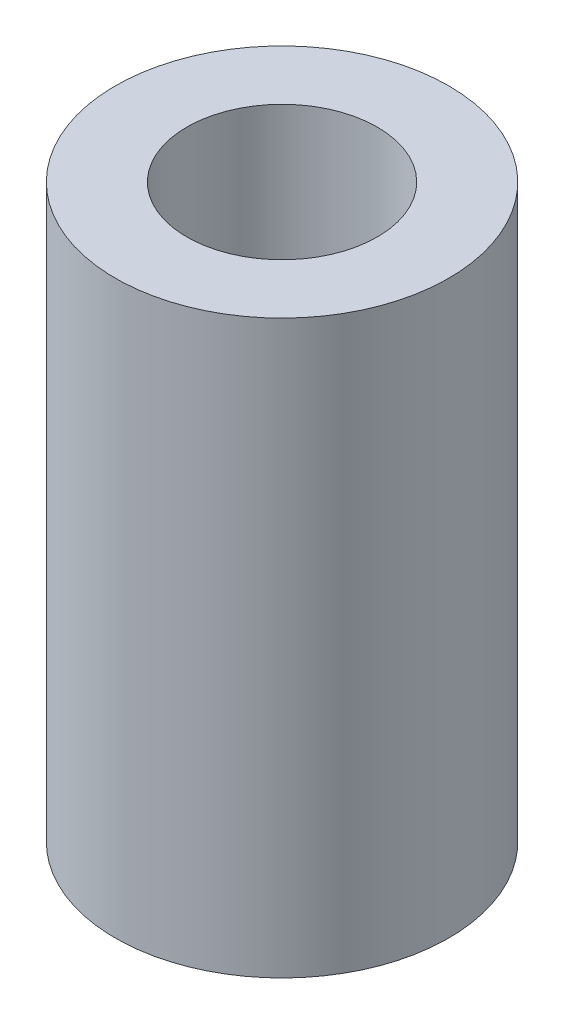
ISO-10303-21;
HEADER;
FILE_DESCRIPTION(('STEP AP214'),'2;1');
FILE_NAME('part.step','',(''),(''),'','','');
FILE_SCHEMA(('AUTOMOTIVE_DESIGN { 1 0 10303 214 1 1 1 1 }'));
ENDSEC;
DATA;
#1=APPLICATION_CONTEXT('core data for automotive mechanical design processes');
#2=APPLICATION_PROTOCOL_DEFINITION('international standard','automotive_design',2000,#1);
#3=PRODUCT_CONTEXT('',#1,'mechanical');
#4=PRODUCT('Part','Part','',(#3));
#5=PRODUCT_RELATED_PRODUCT_CATEGORY('part','',(#4));
#6=PRODUCT_DEFINITION_FORMATION('','',#4);
#7=PRODUCT_DEFINITION_CONTEXT('part definition',#1,'design');
#8=PRODUCT_DEFINITION('design','',#6,#7);
#9=PRODUCT_DEFINITION_SHAPE('','',#8);
#10=(LENGTH_UNIT() NAMED_UNIT(*) SI_UNIT(.MILLI.,.METRE.));
#11=(NAMED_UNIT(*) PLANE_ANGLE_UNIT() SI_UNIT($,.RADIAN.));
#12=(NAMED_UNIT(*) SI_UNIT($,.STERADIAN.) SOLID_ANGLE_UNIT());
#13=UNCERTAINTY_MEASURE_WITH_UNIT(LENGTH_MEASURE(1.E-05),#10,'distance_accuracy_value','');
#14=(GEOMETRIC_REPRESENTATION_CONTEXT(3) GLOBAL_UNCERTAINTY_ASSIGNED_CONTEXT((#13)) GLOBAL_UNIT_ASSIGNED_CONTEXT((#10,
#11,#12)) REPRESENTATION_CONTEXT('',''));
#15=CARTESIAN_POINT('',(0.,0.,0.));
#16=DIRECTION('',(0.,0.,1.));
#17=DIRECTION('',(1.,0.,0.));
#18=AXIS2_PLACEMENT_3D('',#15,#16,#17);
#19=CARTESIAN_POINT('',(0.,76.2,0.));
#20=DIRECTION('',(0.,1.,0.));
#21=DIRECTION('',(0.,0.,1.));
#22=AXIS2_PLACEMENT_3D('',#19,#20,#21);
#23=PLANE('',#22);
#24=CARTESIAN_POINT('',(0.,76.2,0.));
#25=DIRECTION('',(0.,1.,0.));
#26=DIRECTION('',(0.,0.,1.));
#27=AXIS2_PLACEMENT_3D('',#24,#25,#26);
#28=CIRCLE('',#27,22.225);
#29=CARTESIAN_POINT('',(0.,76.2,-22.225));
#30=VERTEX_POINT('',#29);
#31=EDGE_CURVE('E10',#30,#30,#28,.T.);
#32=ORIENTED_EDGE('',*,*,#31,.T.);
#33=EDGE_LOOP('',(#32));
#34=FACE_BOUND('',#33,.T.);
#35=CARTESIAN_POINT('',(0.,76.2,0.));
#36=DIRECTION('',(0.,1.,0.));
#37=DIRECTION('',(0.,0.,1.));
#38=AXIS2_PLACEMENT_3D('',#35,#36,#37);
#39=CIRCLE('',#38,12.7);
#40=CARTESIAN_POINT('',(0.,76.2,-12.7));
#41=VERTEX_POINT('',#40);
#42=EDGE_CURVE('E57',#41,#41,#39,.T.);
#43=ORIENTED_EDGE('',*,*,#42,.F.);
#44=EDGE_LOOP('',(#43));
#45=FACE_BOUND('',#44,.T.);
#46=ADVANCED_FACE('F43',(#34,#45),#23,.T.);
#47=CARTESIAN_POINT('',(0.,0.,0.));
#48=DIRECTION('',(0.,1.,0.));
#49=DIRECTION('',(0.,0.,1.));
#50=AXIS2_PLACEMENT_3D('',#47,#48,#49);
#51=PLANE('',#50);
#52=CARTESIAN_POINT('',(0.,0.,0.));
#53=DIRECTION('',(0.,1.,0.));
#54=DIRECTION('',(0.,0.,1.));
#55=AXIS2_PLACEMENT_3D('',#52,#53,#54);
#56=CIRCLE('',#55,22.225);
#57=CARTESIAN_POINT('',(0.,0.,-22.225));
#58=VERTEX_POINT('',#57);
#59=EDGE_CURVE('E50',#58,#58,#56,.T.);
#60=ORIENTED_EDGE('',*,*,#59,.F.);
#61=EDGE_LOOP('',(#60));
#62=FACE_BOUND('',#61,.T.);
#63=CARTESIAN_POINT('',(0.,0.,0.));
#64=DIRECTION('',(0.,1.,0.));
#65=DIRECTION('',(0.,0.,1.));
#66=AXIS2_PLACEMENT_3D('',#63,#64,#65);
#67=CIRCLE('',#66,12.7);
#68=CARTESIAN_POINT('',(0.,0.,-12.7));
#69=VERTEX_POINT('',#68);
#70=EDGE_CURVE('E59',#69,#69,#67,.T.);
#71=ORIENTED_EDGE('',*,*,#70,.T.);
#72=EDGE_LOOP('',(#71));
#73=FACE_BOUND('',#72,.T.);
#74=ADVANCED_FACE('F68',(#62,#73),#51,.F.);
#75=CARTESIAN_POINT('',(0.,76.2,0.));
#76=DIRECTION('',(0.,-1.,0.));
#77=DIRECTION('',(0.,0.,-1.));
#78=AXIS2_PLACEMENT_3D('',#75,#76,#77);
#79=CYLINDRICAL_SURFACE('',#78,22.225);
#80=CARTESIAN_POINT('',(0.,76.2,-22.225));
#81=CARTESIAN_POINT('',(0.,75.40625,-22.225));
#82=CARTESIAN_POINT('',(0.,74.6125,-22.225));
#83=CARTESIAN_POINT('',(0.,73.025,-22.225));
#84=CARTESIAN_POINT('',(0.,72.23125,-22.225));
#85=CARTESIAN_POINT('',(0.,70.64375,-22.225));
#86=CARTESIAN_POINT('',(0.,69.85,-22.225));
#87=CARTESIAN_POINT('',(0.,68.2625,-22.225));
#88=CARTESIAN_POINT('',(0.,67.46875,-22.225));
#89=CARTESIAN_POINT('',(0.,65.88125,-22.225));
#90=CARTESIAN_POINT('',(0.,65.0875,-22.225));
#91=CARTESIAN_POINT('',(0.,63.5,-22.225));
#92=CARTESIAN_POINT('',(0.,62.70625,-22.225));
#93=CARTESIAN_POINT('',(0.,61.11875,-22.225));
#94=CARTESIAN_POINT('',(0.,60.325,-22.225));
#95=CARTESIAN_POINT('',(0.,58.7375,-22.225));
#96=CARTESIAN_POINT('',(0.,57.94375,-22.225));
#97=CARTESIAN_POINT('',(0.,56.35625,-22.225));
#98=CARTESIAN_POINT('',(0.,55.5625,-22.225));
#99=CARTESIAN_POINT('',(0.,53.975,-22.225));
#100=CARTESIAN_POINT('',(0.,53.18125,-22.225));
#101=CARTESIAN_POINT('',(0.,51.59375,-22.225));
#102=CARTESIAN_POINT('',(0.,50.8,-22.225));
#103=CARTESIAN_POINT('',(0.,49.2125,-22.225));
#104=CARTESIAN_POINT('',(0.,48.41875,-22.225));
#105=CARTESIAN_POINT('',(0.,46.83125,-22.225));
#106=CARTESIAN_POINT('',(0.,46.0375,-22.225));
#107=CARTESIAN_POINT('',(0.,44.45,-22.225));
#108=CARTESIAN_POINT('',(0.,43.65625,-22.225));
#109=CARTESIAN_POINT('',(0.,42.06875,-22.225));
#110=CARTESIAN_POINT('',(0.,41.275,-22.225));
#111=CARTESIAN_POINT('',(0.,39.6875,-22.225));
#112=CARTESIAN_POINT('',(0.,38.89375,-22.225));
#113=CARTESIAN_POINT('',(0.,37.30625,-22.225));
#114=CARTESIAN_POINT('',(0.,36.5125,-22.225));
#115=CARTESIAN_POINT('',(0.,34.925,-22.225));
#116=CARTESIAN_POINT('',(0.,34.13125,-22.225));
#117=CARTESIAN_POINT('',(0.,32.54375,-22.225));
#118=CARTESIAN_POINT('',(0.,31.75,-22.225));
#119=CARTESIAN_POINT('',(0.,30.1625,-22.225));
#120=CARTESIAN_POINT('',(0.,29.36875,-22.225));
#121=CARTESIAN_POINT('',(0.,27.78125,-22.225));
#122=CARTESIAN_POINT('',(0.,26.9875,-22.225));
#123=CARTESIAN_POINT('',(0.,25.4,-22.225));
#124=CARTESIAN_POINT('',(0.,24.60625,-22.225));
#125=CARTESIAN_POINT('',(0.,23.01875,-22.225));
#126=CARTESIAN_POINT('',(0.,22.225,-22.225));
#127=CARTESIAN_POINT('',(0.,20.6375,-22.225));
#128=CARTESIAN_POINT('',(0.,19.84375,-22.225));
#129=CARTESIAN_POINT('',(0.,18.25625,-22.225));
#130=CARTESIAN_POINT('',(0.,17.4625,-22.225));
#131=CARTESIAN_POINT('',(0.,15.875,-22.225));
#132=CARTESIAN_POINT('',(0.,15.08125,-22.225));
#133=CARTESIAN_POINT('',(0.,13.49375,-22.225));
#134=CARTESIAN_POINT('',(0.,12.7,-22.225));
#135=CARTESIAN_POINT('',(0.,11.1125,-22.225));
#136=CARTESIAN_POINT('',(0.,10.31875,-22.225));
#137=CARTESIAN_POINT('',(0.,8.73125,-22.225));
#138=CARTESIAN_POINT('',(0.,7.93750000000001,-22.225));
#139=CARTESIAN_POINT('',(0.,6.35,-22.225));
#140=CARTESIAN_POINT('',(0.,5.55625,-22.225));
#141=CARTESIAN_POINT('',(0.,3.96875,-22.225));
#142=CARTESIAN_POINT('',(0.,3.175,-22.225));
#143=CARTESIAN_POINT('',(0.,1.5875,-22.225));
#144=CARTESIAN_POINT('',(0.,0.793750000000001,-22.225));
#145=CARTESIAN_POINT('',(0.,0.,-22.225));
#146=B_SPLINE_CURVE_WITH_KNOTS('',3,(#80,#81,#82,#83,#84,#85,#86,#87,#88,#89,#90,#91,#92,#93,
#94,#95,#96,#97,#98,#99,#100,#101,#102,#103,#104,#105,#106,#107,#108,#109,#110,#111,#112,#113,
#114,#115,#116,#117,#118,#119,#120,#121,#122,#123,#124,#125,#126,#127,#128,#129,#130,#131,#132,
#133,#134,#135,#136,#137,#138,#139,#140,#141,#142,#143,#144,#145),.UNSPECIFIED.,.F.,.F.,(4,2,2,
2,2,2,2,2,2,2,2,2,2,2,2,2,2,2,2,2,2,2,2,2,2,2,2,2,2,2,2,2,4),(0.,2.38124999999999,
4.76249999999999,7.14374999999999,9.52499999999999,11.90625,14.2875,16.66875,19.05,21.43125,
23.8125,26.19375,28.575,30.95625,33.3375,35.71875,38.1,40.48125,42.8625,45.24375,47.625,
50.00625,52.3875,54.76875,57.15,59.53125,61.9125,64.29375,66.675,69.05625,71.4375,73.81875,
76.2),.UNSPECIFIED.);
#147=EDGE_CURVE('BSEAM44',#30,#58,#146,.T.);
#148=ORIENTED_EDGE('',*,*,#31,.F.);
#149=ORIENTED_EDGE('',*,*,#59,.T.);
#150=ORIENTED_EDGE('',*,*,#147,.T.);
#151=ORIENTED_EDGE('',*,*,#147,.F.);
#152=EDGE_LOOP('',(#148,#150,#149,#151));
#153=FACE_BOUND('',#152,.T.);
#154=ADVANCED_FACE('F44',(#153),#79,.T.);
#155=CARTESIAN_POINT('',(0.,76.2,0.));
#156=DIRECTION('',(0.,-1.,0.));
#157=DIRECTION('',(0.,0.,-1.));
#158=AXIS2_PLACEMENT_3D('',#155,#156,#157);
#159=CYLINDRICAL_SURFACE('',#158,12.7);
#160=CARTESIAN_POINT('',(0.,76.2,-12.7));
#161=CARTESIAN_POINT('',(0.,75.40625,-12.7));
#162=CARTESIAN_POINT('',(0.,74.6125,-12.7));
#163=CARTESIAN_POINT('',(0.,73.025,-12.7));
#164=CARTESIAN_POINT('',(0.,72.23125,-12.7));
#165=CARTESIAN_POINT('',(0.,70.64375,-12.7));
#166=CARTESIAN_POINT('',(0.,69.85,-12.7));
#167=CARTESIAN_POINT('',(0.,68.2625,-12.7));
#168=CARTESIAN_POINT('',(0.,67.46875,-12.7));
#169=CARTESIAN_POINT('',(0.,65.88125,-12.7));
#170=CARTESIAN_POINT('',(0.,65.0875,-12.7));
#171=CARTESIAN_POINT('',(0.,63.5,-12.7));
#172=CARTESIAN_POINT('',(0.,62.70625,-12.7));
#173=CARTESIAN_POINT('',(0.,61.11875,-12.7));
#174=CARTESIAN_POINT('',(0.,60.325,-12.7));
#175=CARTESIAN_POINT('',(0.,58.7375,-12.7));
#176=CARTESIAN_POINT('',(0.,57.94375,-12.7));
#177=CARTESIAN_POINT('',(0.,56.35625,-12.7));
#178=CARTESIAN_POINT('',(0.,55.5625,-12.7));
#179=CARTESIAN_POINT('',(0.,53.975,-12.7));
#180=CARTESIAN_POINT('',(0.,53.18125,-12.7));
#181=CARTESIAN_POINT('',(0.,51.59375,-12.7));
#182=CARTESIAN_POINT('',(0.,50.8,-12.7));
#183=CARTESIAN_POINT('',(0.,49.2125,-12.7));
#184=CARTESIAN_POINT('',(0.,48.41875,-12.7));
#185=CARTESIAN_POINT('',(0.,46.83125,-12.7));
#186=CARTESIAN_POINT('',(0.,46.0375,-12.7));
#187=CARTESIAN_POINT('',(0.,44.45,-12.7));
#188=CARTESIAN_POINT('',(0.,43.65625,-12.7));
#189=CARTESIAN_POINT('',(0.,42.06875,-12.7));
#190=CARTESIAN_POINT('',(0.,41.275,-12.7));
#191=CARTESIAN_POINT('',(0.,39.6875,-12.7));
#192=CARTESIAN_POINT('',(0.,38.89375,-12.7));
#193=CARTESIAN_POINT('',(0.,37.30625,-12.7));
#194=CARTESIAN_POINT('',(0.,36.5125,-12.7));
#195=CARTESIAN_POINT('',(0.,34.925,-12.7));
#196=CARTESIAN_POINT('',(0.,34.13125,-12.7));
#197=CARTESIAN_POINT('',(0.,32.54375,-12.7));
#198=CARTESIAN_POINT('',(0.,31.75,-12.7));
#199=CARTESIAN_POINT('',(0.,30.1625,-12.7));
#200=CARTESIAN_POINT('',(0.,29.36875,-12.7));
#201=CARTESIAN_POINT('',(0.,27.78125,-12.7));
#202=CARTESIAN_POINT('',(0.,26.9875,-12.7));
#203=CARTESIAN_POINT('',(0.,25.4,-12.7));
#204=CARTESIAN_POINT('',(0.,24.60625,-12.7));
#205=CARTESIAN_POINT('',(0.,23.01875,-12.7));
#206=CARTESIAN_POINT('',(0.,22.225,-12.7));
#207=CARTESIAN_POINT('',(0.,20.6375,-12.7));
#208=CARTESIAN_POINT('',(0.,19.84375,-12.7));
#209=CARTESIAN_POINT('',(0.,18.25625,-12.7));
#210=CARTESIAN_POINT('',(0.,17.4625,-12.7));
#211=CARTESIAN_POINT('',(0.,15.875,-12.7));
#212=CARTESIAN_POINT('',(0.,15.08125,-12.7));
#213=CARTESIAN_POINT('',(0.,13.49375,-12.7));
#214=CARTESIAN_POINT('',(0.,12.7,-12.7));
#215=CARTESIAN_POINT('',(0.,11.1125,-12.7));
#216=CARTESIAN_POINT('',(0.,10.31875,-12.7));
#217=CARTESIAN_POINT('',(0.,8.73125,-12.7));
#218=CARTESIAN_POINT('',(0.,7.93750000000001,-12.7));
#219=CARTESIAN_POINT('',(0.,6.35,-12.7));
#220=CARTESIAN_POINT('',(0.,5.55625,-12.7));
#221=CARTESIAN_POINT('',(0.,3.96875,-12.7));
#222=CARTESIAN_POINT('',(0.,3.175,-12.7));
#223=CARTESIAN_POINT('',(0.,1.5875,-12.7));
#224=CARTESIAN_POINT('',(0.,0.793750000000001,-12.7));
#225=CARTESIAN_POINT('',(0.,0.,-12.7));
#226=B_SPLINE_CURVE_WITH_KNOTS('',3,(#160,#161,#162,#163,#164,#165,#166,#167,#168,#169,#170,
#171,#172,#173,#174,#175,#176,#177,#178,#179,#180,#181,#182,#183,#184,#185,#186,#187,#188,#189,
#190,#191,#192,#193,#194,#195,#196,#197,#198,#199,#200,#201,#202,#203,#204,#205,#206,#207,#208,
#209,#210,#211,#212,#213,#214,#215,#216,#217,#218,#219,#220,#221,#222,#223,#224,#225),
.UNSPECIFIED.,.F.,.F.,(4,2,2,2,2,2,2,2,2,2,2,2,2,2,2,2,2,2,2,2,2,2,2,2,2,2,2,2,2,2,2,2,4),(0.,
2.38124999999999,4.76249999999999,7.14374999999999,9.52499999999999,11.90625,14.2875,16.66875,
19.05,21.43125,23.8125,26.19375,28.575,30.95625,33.3375,35.71875,38.1,40.48125,42.8625,45.24375,
47.625,50.00625,52.3875,54.76875,57.15,59.53125,61.9125,64.29375,66.675,69.05625,71.4375,
73.81875,76.2),.UNSPECIFIED.);
#227=EDGE_CURVE('BSEAM67',#41,#69,#226,.T.);
#228=ORIENTED_EDGE('',*,*,#42,.T.);
#229=ORIENTED_EDGE('',*,*,#70,.F.);
#230=ORIENTED_EDGE('',*,*,#227,.T.);
#231=ORIENTED_EDGE('',*,*,#227,.F.);
#232=EDGE_LOOP('',(#228,#230,#229,#231));
#233=FACE_BOUND('',#232,.T.);
#234=ADVANCED_FACE('F67',(#233),#159,.F.);
#235=CLOSED_SHELL('',(#46,#74,#154,#234));
#236=MANIFOLD_SOLID_BREP('B2',#235);
#237=ADVANCED_BREP_SHAPE_REPRESENTATION('',(#18,#236),#14);
#238=SHAPE_DEFINITION_REPRESENTATION(#9,#237);
ENDSEC;
END-ISO-10303-21;
